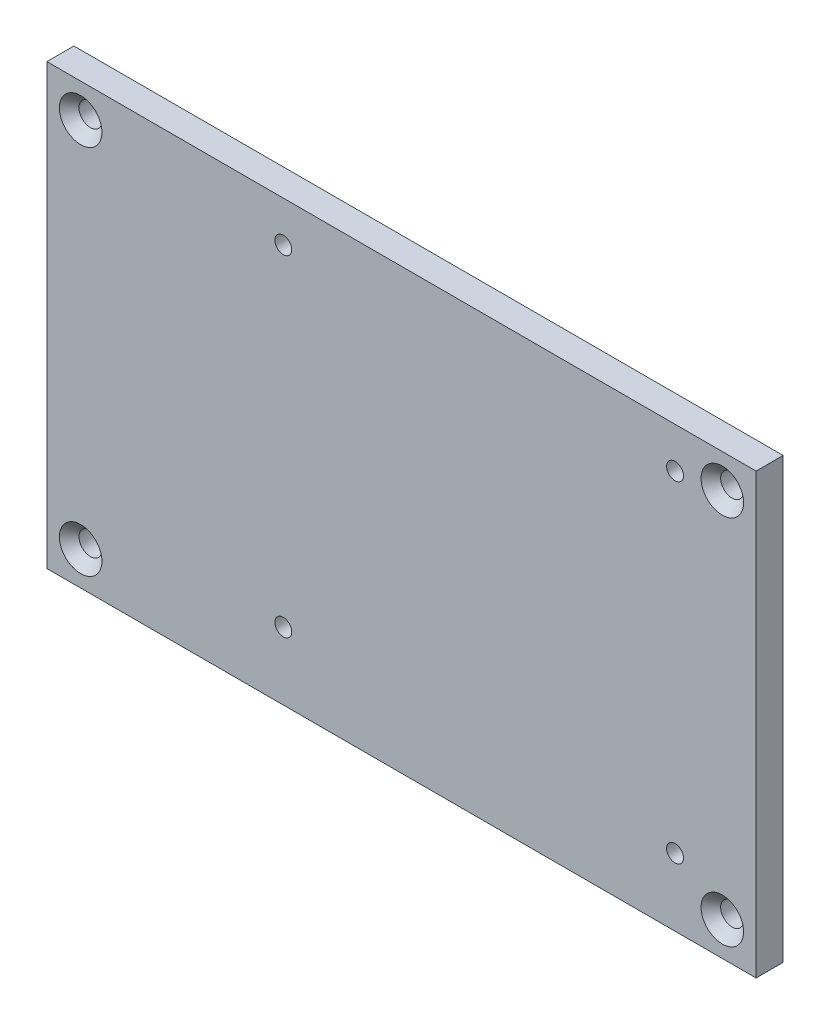
ISO-10303-21;
HEADER;
FILE_DESCRIPTION(('STEP AP214'),'2;1');
FILE_NAME('part.step','',(''),(''),'','','');
FILE_SCHEMA(('AUTOMOTIVE_DESIGN { 1 0 10303 214 1 1 1 1 }'));
ENDSEC;
DATA;
#1=APPLICATION_CONTEXT('core data for automotive mechanical design processes');
#2=APPLICATION_PROTOCOL_DEFINITION('international standard','automotive_design',2000,#1);
#3=PRODUCT_CONTEXT('',#1,'mechanical');
#4=PRODUCT('Part','Part','',(#3));
#5=PRODUCT_RELATED_PRODUCT_CATEGORY('part','',(#4));
#6=PRODUCT_DEFINITION_FORMATION('','',#4);
#7=PRODUCT_DEFINITION_CONTEXT('part definition',#1,'design');
#8=PRODUCT_DEFINITION('design','',#6,#7);
#9=PRODUCT_DEFINITION_SHAPE('','',#8);
#10=(LENGTH_UNIT() NAMED_UNIT(*) SI_UNIT(.MILLI.,.METRE.));
#11=(NAMED_UNIT(*) PLANE_ANGLE_UNIT() SI_UNIT($,.RADIAN.));
#12=(NAMED_UNIT(*) SI_UNIT($,.STERADIAN.) SOLID_ANGLE_UNIT());
#13=UNCERTAINTY_MEASURE_WITH_UNIT(LENGTH_MEASURE(1.E-05),#10,'distance_accuracy_value','');
#14=(GEOMETRIC_REPRESENTATION_CONTEXT(3) GLOBAL_UNCERTAINTY_ASSIGNED_CONTEXT((#13)) GLOBAL_UNIT_ASSIGNED_CONTEXT((#10,
#11,#12)) REPRESENTATION_CONTEXT('',''));
#15=CARTESIAN_POINT('',(0.,0.,0.));
#16=DIRECTION('',(0.,0.,1.));
#17=DIRECTION('',(1.,0.,0.));
#18=AXIS2_PLACEMENT_3D('',#15,#16,#17);
#19=CARTESIAN_POINT('',(52.5,-32.5,4.));
#20=DIRECTION('',(-1.,0.,0.));
#21=DIRECTION('',(0.,0.,1.));
#22=AXIS2_PLACEMENT_3D('',#19,#20,#21);
#23=PLANE('',#22);
#24=DIRECTION('',(0.,1.,0.));
#25=VECTOR('',#24,1.);
#26=CARTESIAN_POINT('',(52.5,-32.5,0.));
#27=LINE('',#26,#25);
#28=CARTESIAN_POINT('',(52.5,-32.5,0.));
#29=VERTEX_POINT('',#28);
#30=CARTESIAN_POINT('',(52.5,32.5,0.));
#31=VERTEX_POINT('',#30);
#32=EDGE_CURVE('E98',#29,#31,#27,.T.);
#33=ORIENTED_EDGE('',*,*,#32,.T.);
#34=DIRECTION('',(0.,0.,-1.));
#35=VECTOR('',#34,1.);
#36=CARTESIAN_POINT('',(52.5,32.5,4.));
#37=LINE('',#36,#35);
#38=CARTESIAN_POINT('',(52.5,32.5,4.));
#39=VERTEX_POINT('',#38);
#40=EDGE_CURVE('E11',#39,#31,#37,.T.);
#41=ORIENTED_EDGE('',*,*,#40,.F.);
#42=DIRECTION('',(0.,1.,0.));
#43=VECTOR('',#42,1.);
#44=CARTESIAN_POINT('',(52.5,-32.5,4.));
#45=LINE('',#44,#43);
#46=CARTESIAN_POINT('',(52.5,-32.5,4.));
#47=VERTEX_POINT('',#46);
#48=EDGE_CURVE('E86',#47,#39,#45,.T.);
#49=ORIENTED_EDGE('',*,*,#48,.F.);
#50=DIRECTION('',(0.,0.,-1.));
#51=VECTOR('',#50,1.);
#52=CARTESIAN_POINT('',(52.5,-32.5,4.));
#53=LINE('',#52,#51);
#54=EDGE_CURVE('E94',#47,#29,#53,.T.);
#55=ORIENTED_EDGE('',*,*,#54,.T.);
#56=EDGE_LOOP('',(#33,#41,#49,#55));
#57=FACE_BOUND('',#56,.T.);
#58=ADVANCED_FACE('F35',(#57),#23,.F.);
#59=CARTESIAN_POINT('',(-52.5,32.5,4.));
#60=DIRECTION('',(0.,-1.,0.));
#61=DIRECTION('',(0.,0.,-1.));
#62=AXIS2_PLACEMENT_3D('',#59,#60,#61);
#63=PLANE('',#62);
#64=DIRECTION('',(-1.,0.,0.));
#65=VECTOR('',#64,1.);
#66=CARTESIAN_POINT('',(-52.5,32.5,0.));
#67=LINE('',#66,#65);
#68=CARTESIAN_POINT('',(-52.5,32.5,0.));
#69=VERTEX_POINT('',#68);
#70=EDGE_CURVE('E90',#31,#69,#67,.T.);
#71=ORIENTED_EDGE('',*,*,#70,.T.);
#72=DIRECTION('',(0.,0.,-1.));
#73=VECTOR('',#72,1.);
#74=CARTESIAN_POINT('',(-52.5,32.5,4.));
#75=LINE('',#74,#73);
#76=CARTESIAN_POINT('',(-52.5,32.5,4.));
#77=VERTEX_POINT('',#76);
#78=EDGE_CURVE('E43',#77,#69,#75,.T.);
#79=ORIENTED_EDGE('',*,*,#78,.F.);
#80=DIRECTION('',(-1.,0.,0.));
#81=VECTOR('',#80,1.);
#82=CARTESIAN_POINT('',(-52.5,32.5,4.));
#83=LINE('',#82,#81);
#84=EDGE_CURVE('E81',#39,#77,#83,.T.);
#85=ORIENTED_EDGE('',*,*,#84,.F.);
#86=ORIENTED_EDGE('',*,*,#40,.T.);
#87=EDGE_LOOP('',(#71,#79,#85,#86));
#88=FACE_BOUND('',#87,.T.);
#89=ADVANCED_FACE('F89',(#88),#63,.F.);
#90=CARTESIAN_POINT('',(-52.5,-32.5,4.));
#91=DIRECTION('',(1.,0.,0.));
#92=DIRECTION('',(0.,0.,-1.));
#93=AXIS2_PLACEMENT_3D('',#90,#91,#92);
#94=PLANE('',#93);
#95=DIRECTION('',(0.,-1.,0.));
#96=VECTOR('',#95,1.);
#97=CARTESIAN_POINT('',(-52.5,-32.5,0.));
#98=LINE('',#97,#96);
#99=CARTESIAN_POINT('',(-52.5,-32.5,0.));
#100=VERTEX_POINT('',#99);
#101=EDGE_CURVE('E68',#69,#100,#98,.T.);
#102=ORIENTED_EDGE('',*,*,#101,.T.);
#103=DIRECTION('',(0.,0.,-1.));
#104=VECTOR('',#103,1.);
#105=CARTESIAN_POINT('',(-52.5,-32.5,4.));
#106=LINE('',#105,#104);
#107=CARTESIAN_POINT('',(-52.5,-32.5,4.));
#108=VERTEX_POINT('',#107);
#109=EDGE_CURVE('E91',#108,#100,#106,.T.);
#110=ORIENTED_EDGE('',*,*,#109,.F.);
#111=DIRECTION('',(0.,-1.,0.));
#112=VECTOR('',#111,1.);
#113=CARTESIAN_POINT('',(-52.5,-32.5,4.));
#114=LINE('',#113,#112);
#115=EDGE_CURVE('E84',#77,#108,#114,.T.);
#116=ORIENTED_EDGE('',*,*,#115,.F.);
#117=ORIENTED_EDGE('',*,*,#78,.T.);
#118=EDGE_LOOP('',(#102,#110,#116,#117));
#119=FACE_BOUND('',#118,.T.);
#120=ADVANCED_FACE('F92',(#119),#94,.F.);
#121=CARTESIAN_POINT('',(-52.5,-32.5,4.));
#122=DIRECTION('',(0.,1.,0.));
#123=DIRECTION('',(0.,0.,1.));
#124=AXIS2_PLACEMENT_3D('',#121,#122,#123);
#125=PLANE('',#124);
#126=DIRECTION('',(1.,0.,0.));
#127=VECTOR('',#126,1.);
#128=CARTESIAN_POINT('',(-52.5,-32.5,0.));
#129=LINE('',#128,#127);
#130=EDGE_CURVE('E74',#100,#29,#129,.T.);
#131=ORIENTED_EDGE('',*,*,#130,.T.);
#132=ORIENTED_EDGE('',*,*,#54,.F.);
#133=DIRECTION('',(1.,0.,0.));
#134=VECTOR('',#133,1.);
#135=CARTESIAN_POINT('',(-52.5,-32.5,4.));
#136=LINE('',#135,#134);
#137=EDGE_CURVE('E51',#108,#47,#136,.T.);
#138=ORIENTED_EDGE('',*,*,#137,.F.);
#139=ORIENTED_EDGE('',*,*,#109,.T.);
#140=EDGE_LOOP('',(#131,#132,#138,#139));
#141=FACE_BOUND('',#140,.T.);
#142=ADVANCED_FACE('F106',(#141),#125,.F.);
#143=CARTESIAN_POINT('',(0.,0.,4.));
#144=DIRECTION('',(0.,0.,-1.));
#145=DIRECTION('',(-1.,0.,0.));
#146=AXIS2_PLACEMENT_3D('',#143,#144,#145);
#147=PLANE('',#146);
#148=CARTESIAN_POINT('',(-47.5,27.5,4.));
#149=DIRECTION('',(0.,0.,1.));
#150=DIRECTION('',(1.,0.,0.));
#151=AXIS2_PLACEMENT_3D('',#148,#149,#150);
#152=CIRCLE('',#151,3.15);
#153=CARTESIAN_POINT('',(-44.35,27.5,4.));
#154=VERTEX_POINT('',#153);
#155=EDGE_CURVE('E168',#154,#154,#152,.T.);
#156=ORIENTED_EDGE('',*,*,#155,.F.);
#157=EDGE_LOOP('',(#156));
#158=FACE_BOUND('',#157,.T.);
#159=CARTESIAN_POINT('',(-47.5,-27.5,4.));
#160=DIRECTION('',(0.,0.,1.));
#161=DIRECTION('',(1.,0.,0.));
#162=AXIS2_PLACEMENT_3D('',#159,#160,#161);
#163=CIRCLE('',#162,3.15);
#164=CARTESIAN_POINT('',(-44.35,-27.5,4.));
#165=VERTEX_POINT('',#164);
#166=EDGE_CURVE('E159',#165,#165,#163,.T.);
#167=ORIENTED_EDGE('',*,*,#166,.F.);
#168=EDGE_LOOP('',(#167));
#169=FACE_BOUND('',#168,.T.);
#170=CARTESIAN_POINT('',(47.5,27.5,4.));
#171=DIRECTION('',(0.,0.,1.));
#172=DIRECTION('',(1.,0.,0.));
#173=AXIS2_PLACEMENT_3D('',#170,#171,#172);
#174=CIRCLE('',#173,3.15);
#175=CARTESIAN_POINT('',(50.65,27.5,4.));
#176=VERTEX_POINT('',#175);
#177=EDGE_CURVE('E150',#176,#176,#174,.T.);
#178=ORIENTED_EDGE('',*,*,#177,.F.);
#179=EDGE_LOOP('',(#178));
#180=FACE_BOUND('',#179,.T.);
#181=CARTESIAN_POINT('',(47.5,-27.5,4.));
#182=DIRECTION('',(0.,0.,1.));
#183=DIRECTION('',(1.,0.,0.));
#184=AXIS2_PLACEMENT_3D('',#181,#182,#183);
#185=CIRCLE('',#184,3.15);
#186=CARTESIAN_POINT('',(50.65,-27.5,4.));
#187=VERTEX_POINT('',#186);
#188=EDGE_CURVE('E141',#187,#187,#185,.T.);
#189=ORIENTED_EDGE('',*,*,#188,.F.);
#190=EDGE_LOOP('',(#189));
#191=FACE_BOUND('',#190,.T.);
#192=CARTESIAN_POINT('',(40.5,26.5,4.));
#193=DIRECTION('',(0.,0.,1.));
#194=DIRECTION('',(1.,0.,0.));
#195=AXIS2_PLACEMENT_3D('',#192,#193,#194);
#196=CIRCLE('',#195,1.25);
#197=CARTESIAN_POINT('',(41.75,26.5,4.));
#198=VERTEX_POINT('',#197);
#199=EDGE_CURVE('E132',#198,#198,#196,.T.);
#200=ORIENTED_EDGE('',*,*,#199,.F.);
#201=EDGE_LOOP('',(#200));
#202=FACE_BOUND('',#201,.T.);
#203=CARTESIAN_POINT('',(40.5,-22.5,4.));
#204=DIRECTION('',(0.,0.,1.));
#205=DIRECTION('',(1.,0.,0.));
#206=AXIS2_PLACEMENT_3D('',#203,#204,#205);
#207=CIRCLE('',#206,1.25);
#208=CARTESIAN_POINT('',(41.75,-22.5,4.));
#209=VERTEX_POINT('',#208);
#210=EDGE_CURVE('E126',#209,#209,#207,.T.);
#211=ORIENTED_EDGE('',*,*,#210,.F.);
#212=EDGE_LOOP('',(#211));
#213=FACE_BOUND('',#212,.T.);
#214=CARTESIAN_POINT('',(-17.5,-22.5,4.));
#215=DIRECTION('',(0.,0.,1.));
#216=DIRECTION('',(1.,0.,0.));
#217=AXIS2_PLACEMENT_3D('',#214,#215,#216);
#218=CIRCLE('',#217,1.25);
#219=CARTESIAN_POINT('',(-16.25,-22.5,4.));
#220=VERTEX_POINT('',#219);
#221=EDGE_CURVE('E120',#220,#220,#218,.T.);
#222=ORIENTED_EDGE('',*,*,#221,.F.);
#223=EDGE_LOOP('',(#222));
#224=FACE_BOUND('',#223,.T.);
#225=CARTESIAN_POINT('',(-17.5,26.5,4.));
#226=DIRECTION('',(0.,0.,1.));
#227=DIRECTION('',(1.,0.,0.));
#228=AXIS2_PLACEMENT_3D('',#225,#226,#227);
#229=CIRCLE('',#228,1.25);
#230=CARTESIAN_POINT('',(-16.25,26.5,4.));
#231=VERTEX_POINT('',#230);
#232=EDGE_CURVE('E114',#231,#231,#229,.T.);
#233=ORIENTED_EDGE('',*,*,#232,.F.);
#234=EDGE_LOOP('',(#233));
#235=FACE_BOUND('',#234,.T.);
#236=ORIENTED_EDGE('',*,*,#48,.T.);
#237=ORIENTED_EDGE('',*,*,#84,.T.);
#238=ORIENTED_EDGE('',*,*,#115,.T.);
#239=ORIENTED_EDGE('',*,*,#137,.T.);
#240=EDGE_LOOP('',(#236,#237,#238,#239));
#241=FACE_BOUND('',#240,.T.);
#242=ADVANCED_FACE('F82',(#158,#169,#180,#191,#202,#213,#224,#235,#241),#147,.F.);
#243=CARTESIAN_POINT('',(0.,0.,0.));
#244=DIRECTION('',(0.,0.,-1.));
#245=DIRECTION('',(-1.,0.,0.));
#246=AXIS2_PLACEMENT_3D('',#243,#244,#245);
#247=PLANE('',#246);
#248=CARTESIAN_POINT('',(-47.5,27.5,0.));
#249=DIRECTION('',(0.,0.,1.));
#250=DIRECTION('',(1.,0.,0.));
#251=AXIS2_PLACEMENT_3D('',#248,#249,#250);
#252=CIRCLE('',#251,1.7);
#253=CARTESIAN_POINT('',(-45.8,27.5,0.));
#254=VERTEX_POINT('',#253);
#255=EDGE_CURVE('E162',#254,#254,#252,.T.);
#256=ORIENTED_EDGE('',*,*,#255,.T.);
#257=EDGE_LOOP('',(#256));
#258=FACE_BOUND('',#257,.T.);
#259=CARTESIAN_POINT('',(-47.5,-27.5,0.));
#260=DIRECTION('',(0.,0.,1.));
#261=DIRECTION('',(1.,0.,0.));
#262=AXIS2_PLACEMENT_3D('',#259,#260,#261);
#263=CIRCLE('',#262,1.7);
#264=CARTESIAN_POINT('',(-45.8,-27.5,0.));
#265=VERTEX_POINT('',#264);
#266=EDGE_CURVE('E153',#265,#265,#263,.T.);
#267=ORIENTED_EDGE('',*,*,#266,.T.);
#268=EDGE_LOOP('',(#267));
#269=FACE_BOUND('',#268,.T.);
#270=CARTESIAN_POINT('',(47.5,27.5,0.));
#271=DIRECTION('',(0.,0.,1.));
#272=DIRECTION('',(1.,0.,0.));
#273=AXIS2_PLACEMENT_3D('',#270,#271,#272);
#274=CIRCLE('',#273,1.7);
#275=CARTESIAN_POINT('',(49.2,27.5,0.));
#276=VERTEX_POINT('',#275);
#277=EDGE_CURVE('E144',#276,#276,#274,.T.);
#278=ORIENTED_EDGE('',*,*,#277,.T.);
#279=EDGE_LOOP('',(#278));
#280=FACE_BOUND('',#279,.T.);
#281=CARTESIAN_POINT('',(47.5,-27.5,0.));
#282=DIRECTION('',(0.,0.,1.));
#283=DIRECTION('',(1.,0.,0.));
#284=AXIS2_PLACEMENT_3D('',#281,#282,#283);
#285=CIRCLE('',#284,1.7);
#286=CARTESIAN_POINT('',(49.2,-27.5,0.));
#287=VERTEX_POINT('',#286);
#288=EDGE_CURVE('E135',#287,#287,#285,.T.);
#289=ORIENTED_EDGE('',*,*,#288,.T.);
#290=EDGE_LOOP('',(#289));
#291=FACE_BOUND('',#290,.T.);
#292=CARTESIAN_POINT('',(40.5,26.5,0.));
#293=DIRECTION('',(0.,0.,1.));
#294=DIRECTION('',(1.,0.,0.));
#295=AXIS2_PLACEMENT_3D('',#292,#293,#294);
#296=CIRCLE('',#295,1.25);
#297=CARTESIAN_POINT('',(41.75,26.5,0.));
#298=VERTEX_POINT('',#297);
#299=EDGE_CURVE('E129',#298,#298,#296,.T.);
#300=ORIENTED_EDGE('',*,*,#299,.T.);
#301=EDGE_LOOP('',(#300));
#302=FACE_BOUND('',#301,.T.);
#303=CARTESIAN_POINT('',(40.5,-22.5,0.));
#304=DIRECTION('',(0.,0.,1.));
#305=DIRECTION('',(1.,0.,0.));
#306=AXIS2_PLACEMENT_3D('',#303,#304,#305);
#307=CIRCLE('',#306,1.25);
#308=CARTESIAN_POINT('',(41.75,-22.5,0.));
#309=VERTEX_POINT('',#308);
#310=EDGE_CURVE('E123',#309,#309,#307,.T.);
#311=ORIENTED_EDGE('',*,*,#310,.T.);
#312=EDGE_LOOP('',(#311));
#313=FACE_BOUND('',#312,.T.);
#314=CARTESIAN_POINT('',(-17.5,-22.5,0.));
#315=DIRECTION('',(0.,0.,1.));
#316=DIRECTION('',(1.,0.,0.));
#317=AXIS2_PLACEMENT_3D('',#314,#315,#316);
#318=CIRCLE('',#317,1.25);
#319=CARTESIAN_POINT('',(-16.25,-22.5,0.));
#320=VERTEX_POINT('',#319);
#321=EDGE_CURVE('E117',#320,#320,#318,.T.);
#322=ORIENTED_EDGE('',*,*,#321,.T.);
#323=EDGE_LOOP('',(#322));
#324=FACE_BOUND('',#323,.T.);
#325=CARTESIAN_POINT('',(-17.5,26.5,0.));
#326=DIRECTION('',(0.,0.,1.));
#327=DIRECTION('',(1.,0.,0.));
#328=AXIS2_PLACEMENT_3D('',#325,#326,#327);
#329=CIRCLE('',#328,1.25);
#330=CARTESIAN_POINT('',(-16.25,26.5,0.));
#331=VERTEX_POINT('',#330);
#332=EDGE_CURVE('E101',#331,#331,#329,.T.);
#333=ORIENTED_EDGE('',*,*,#332,.T.);
#334=EDGE_LOOP('',(#333));
#335=FACE_BOUND('',#334,.T.);
#336=ORIENTED_EDGE('',*,*,#32,.F.);
#337=ORIENTED_EDGE('',*,*,#130,.F.);
#338=ORIENTED_EDGE('',*,*,#101,.F.);
#339=ORIENTED_EDGE('',*,*,#70,.F.);
#340=EDGE_LOOP('',(#336,#337,#338,#339));
#341=FACE_BOUND('',#340,.T.);
#342=ADVANCED_FACE('F109',(#258,#269,#280,#291,#302,#313,#324,#335,#341),#247,.T.);
#343=CARTESIAN_POINT('',(-17.5,26.5,4.));
#344=DIRECTION('',(0.,0.,1.));
#345=DIRECTION('',(1.,0.,0.));
#346=AXIS2_PLACEMENT_3D('',#343,#344,#345);
#347=CYLINDRICAL_SURFACE('',#346,1.25);
#348=ORIENTED_EDGE('',*,*,#332,.F.);
#349=EDGE_LOOP('',(#348));
#350=FACE_BOUND('',#349,.T.);
#351=ORIENTED_EDGE('',*,*,#232,.T.);
#352=EDGE_LOOP('',(#351));
#353=FACE_BOUND('',#352,.T.);
#354=ADVANCED_FACE('F191',(#350,#353),#347,.F.);
#355=CARTESIAN_POINT('',(-17.5,-22.5,4.));
#356=DIRECTION('',(0.,0.,1.));
#357=DIRECTION('',(1.,0.,0.));
#358=AXIS2_PLACEMENT_3D('',#355,#356,#357);
#359=CYLINDRICAL_SURFACE('',#358,1.25);
#360=ORIENTED_EDGE('',*,*,#321,.F.);
#361=EDGE_LOOP('',(#360));
#362=FACE_BOUND('',#361,.T.);
#363=ORIENTED_EDGE('',*,*,#221,.T.);
#364=EDGE_LOOP('',(#363));
#365=FACE_BOUND('',#364,.T.);
#366=ADVANCED_FACE('F193',(#362,#365),#359,.F.);
#367=CARTESIAN_POINT('',(40.5,-22.5,4.));
#368=DIRECTION('',(0.,0.,1.));
#369=DIRECTION('',(1.,0.,0.));
#370=AXIS2_PLACEMENT_3D('',#367,#368,#369);
#371=CYLINDRICAL_SURFACE('',#370,1.25);
#372=ORIENTED_EDGE('',*,*,#310,.F.);
#373=EDGE_LOOP('',(#372));
#374=FACE_BOUND('',#373,.T.);
#375=ORIENTED_EDGE('',*,*,#210,.T.);
#376=EDGE_LOOP('',(#375));
#377=FACE_BOUND('',#376,.T.);
#378=ADVANCED_FACE('F200',(#374,#377),#371,.F.);
#379=CARTESIAN_POINT('',(40.5,26.5,4.));
#380=DIRECTION('',(0.,0.,1.));
#381=DIRECTION('',(1.,0.,0.));
#382=AXIS2_PLACEMENT_3D('',#379,#380,#381);
#383=CYLINDRICAL_SURFACE('',#382,1.25);
#384=ORIENTED_EDGE('',*,*,#299,.F.);
#385=EDGE_LOOP('',(#384));
#386=FACE_BOUND('',#385,.T.);
#387=ORIENTED_EDGE('',*,*,#199,.T.);
#388=EDGE_LOOP('',(#387));
#389=FACE_BOUND('',#388,.T.);
#390=ADVANCED_FACE('F242',(#386,#389),#383,.F.);
#391=CARTESIAN_POINT('',(47.5,-27.5,4.));
#392=DIRECTION('',(0.,0.,1.));
#393=DIRECTION('',(1.,0.,0.));
#394=AXIS2_PLACEMENT_3D('',#391,#392,#393);
#395=CYLINDRICAL_SURFACE('',#394,1.7);
#396=ORIENTED_EDGE('',*,*,#288,.F.);
#397=EDGE_LOOP('',(#396));
#398=FACE_BOUND('',#397,.T.);
#399=CARTESIAN_POINT('',(47.5,-27.5,2.55));
#400=DIRECTION('',(0.,0.,1.));
#401=DIRECTION('',(1.,0.,0.));
#402=AXIS2_PLACEMENT_3D('',#399,#400,#401);
#403=CIRCLE('',#402,1.7);
#404=CARTESIAN_POINT('',(49.2,-27.5,2.55));
#405=VERTEX_POINT('',#404);
#406=EDGE_CURVE('E138',#405,#405,#403,.T.);
#407=ORIENTED_EDGE('',*,*,#406,.T.);
#408=EDGE_LOOP('',(#407));
#409=FACE_BOUND('',#408,.T.);
#410=ADVANCED_FACE('F236',(#398,#409),#395,.F.);
#411=CARTESIAN_POINT('',(47.5,-27.5,4.));
#412=DIRECTION('',(0.,0.,1.));
#413=DIRECTION('',(1.,0.,0.));
#414=AXIS2_PLACEMENT_3D('',#411,#412,#413);
#415=CONICAL_SURFACE('',#414,3.15,0.785398163397448);
#416=ORIENTED_EDGE('',*,*,#406,.F.);
#417=EDGE_LOOP('',(#416));
#418=FACE_BOUND('',#417,.T.);
#419=ORIENTED_EDGE('',*,*,#188,.T.);
#420=EDGE_LOOP('',(#419));
#421=FACE_BOUND('',#420,.T.);
#422=ADVANCED_FACE('F241',(#418,#421),#415,.F.);
#423=CARTESIAN_POINT('',(47.5,27.5,4.));
#424=DIRECTION('',(0.,0.,1.));
#425=DIRECTION('',(1.,0.,0.));
#426=AXIS2_PLACEMENT_3D('',#423,#424,#425);
#427=CYLINDRICAL_SURFACE('',#426,1.7);
#428=ORIENTED_EDGE('',*,*,#277,.F.);
#429=EDGE_LOOP('',(#428));
#430=FACE_BOUND('',#429,.T.);
#431=CARTESIAN_POINT('',(47.5,27.5,2.55));
#432=DIRECTION('',(0.,0.,1.));
#433=DIRECTION('',(1.,0.,0.));
#434=AXIS2_PLACEMENT_3D('',#431,#432,#433);
#435=CIRCLE('',#434,1.7);
#436=CARTESIAN_POINT('',(49.2,27.5,2.55));
#437=VERTEX_POINT('',#436);
#438=EDGE_CURVE('E147',#437,#437,#435,.T.);
#439=ORIENTED_EDGE('',*,*,#438,.T.);
#440=EDGE_LOOP('',(#439));
#441=FACE_BOUND('',#440,.T.);
#442=ADVANCED_FACE('F254',(#430,#441),#427,.F.);
#443=CARTESIAN_POINT('',(47.5,27.5,4.));
#444=DIRECTION('',(0.,0.,1.));
#445=DIRECTION('',(1.,0.,0.));
#446=AXIS2_PLACEMENT_3D('',#443,#444,#445);
#447=CONICAL_SURFACE('',#446,3.15,0.785398163397448);
#448=ORIENTED_EDGE('',*,*,#438,.F.);
#449=EDGE_LOOP('',(#448));
#450=FACE_BOUND('',#449,.T.);
#451=ORIENTED_EDGE('',*,*,#177,.T.);
#452=EDGE_LOOP('',(#451));
#453=FACE_BOUND('',#452,.T.);
#454=ADVANCED_FACE('F264',(#450,#453),#447,.F.);
#455=CARTESIAN_POINT('',(-47.5,-27.5,4.));
#456=DIRECTION('',(0.,0.,1.));
#457=DIRECTION('',(1.,0.,0.));
#458=AXIS2_PLACEMENT_3D('',#455,#456,#457);
#459=CYLINDRICAL_SURFACE('',#458,1.7);
#460=ORIENTED_EDGE('',*,*,#266,.F.);
#461=EDGE_LOOP('',(#460));
#462=FACE_BOUND('',#461,.T.);
#463=CARTESIAN_POINT('',(-47.5,-27.5,2.55));
#464=DIRECTION('',(0.,0.,1.));
#465=DIRECTION('',(1.,0.,0.));
#466=AXIS2_PLACEMENT_3D('',#463,#464,#465);
#467=CIRCLE('',#466,1.7);
#468=CARTESIAN_POINT('',(-45.8,-27.5,2.55));
#469=VERTEX_POINT('',#468);
#470=EDGE_CURVE('E156',#469,#469,#467,.T.);
#471=ORIENTED_EDGE('',*,*,#470,.T.);
#472=EDGE_LOOP('',(#471));
#473=FACE_BOUND('',#472,.T.);
#474=ADVANCED_FACE('F274',(#462,#473),#459,.F.);
#475=CARTESIAN_POINT('',(-47.5,-27.5,4.));
#476=DIRECTION('',(0.,0.,1.));
#477=DIRECTION('',(1.,0.,0.));
#478=AXIS2_PLACEMENT_3D('',#475,#476,#477);
#479=CONICAL_SURFACE('',#478,3.15,0.785398163397448);
#480=ORIENTED_EDGE('',*,*,#470,.F.);
#481=EDGE_LOOP('',(#480));
#482=FACE_BOUND('',#481,.T.);
#483=ORIENTED_EDGE('',*,*,#166,.T.);
#484=EDGE_LOOP('',(#483));
#485=FACE_BOUND('',#484,.T.);
#486=ADVANCED_FACE('F284',(#482,#485),#479,.F.);
#487=CARTESIAN_POINT('',(-47.5,27.5,4.));
#488=DIRECTION('',(0.,0.,1.));
#489=DIRECTION('',(1.,0.,0.));
#490=AXIS2_PLACEMENT_3D('',#487,#488,#489);
#491=CYLINDRICAL_SURFACE('',#490,1.7);
#492=ORIENTED_EDGE('',*,*,#255,.F.);
#493=EDGE_LOOP('',(#492));
#494=FACE_BOUND('',#493,.T.);
#495=CARTESIAN_POINT('',(-47.5,27.5,2.55));
#496=DIRECTION('',(0.,0.,1.));
#497=DIRECTION('',(1.,0.,0.));
#498=AXIS2_PLACEMENT_3D('',#495,#496,#497);
#499=CIRCLE('',#498,1.7);
#500=CARTESIAN_POINT('',(-45.8,27.5,2.55));
#501=VERTEX_POINT('',#500);
#502=EDGE_CURVE('E165',#501,#501,#499,.T.);
#503=ORIENTED_EDGE('',*,*,#502,.T.);
#504=EDGE_LOOP('',(#503));
#505=FACE_BOUND('',#504,.T.);
#506=ADVANCED_FACE('F294',(#494,#505),#491,.F.);
#507=CARTESIAN_POINT('',(-47.5,27.5,4.));
#508=DIRECTION('',(0.,0.,1.));
#509=DIRECTION('',(1.,0.,0.));
#510=AXIS2_PLACEMENT_3D('',#507,#508,#509);
#511=CONICAL_SURFACE('',#510,3.15,0.785398163397448);
#512=ORIENTED_EDGE('',*,*,#502,.F.);
#513=EDGE_LOOP('',(#512));
#514=FACE_BOUND('',#513,.T.);
#515=ORIENTED_EDGE('',*,*,#155,.T.);
#516=EDGE_LOOP('',(#515));
#517=FACE_BOUND('',#516,.T.);
#518=ADVANCED_FACE('F172',(#514,#517),#511,.F.);
#519=CLOSED_SHELL('',(#58,#89,#120,#142,#242,#342,#354,#366,#378,#390,#410,#422,#442,#454,#474,
#486,#506,#518));
#520=MANIFOLD_SOLID_BREP('B2',#519);
#521=ADVANCED_BREP_SHAPE_REPRESENTATION('',(#18,#520),#14);
#522=SHAPE_DEFINITION_REPRESENTATION(#9,#521);
ENDSEC;
END-ISO-10303-21;
